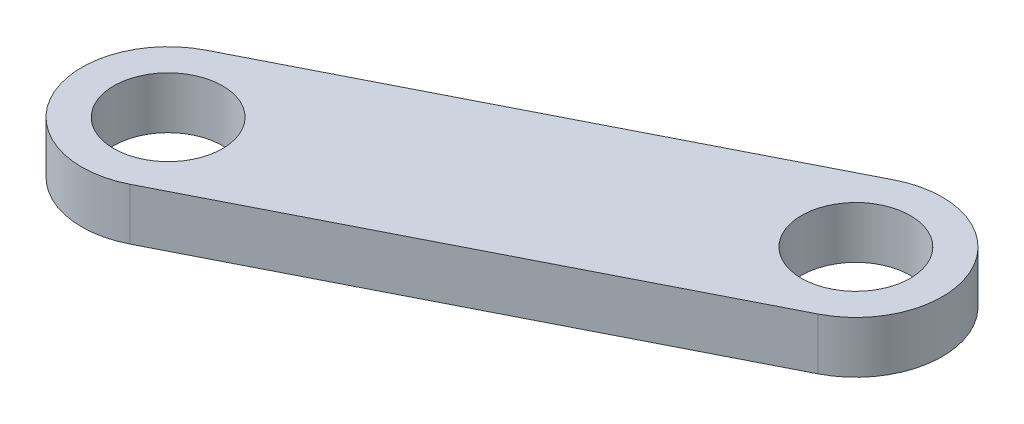
ISO-10303-21;
HEADER;
FILE_DESCRIPTION(('STEP AP214'),'2;1');
FILE_NAME('part.step','',(''),(''),'','','');
FILE_SCHEMA(('AUTOMOTIVE_DESIGN { 1 0 10303 214 1 1 1 1 }'));
ENDSEC;
DATA;
#1=APPLICATION_CONTEXT('core data for automotive mechanical design processes');
#2=APPLICATION_PROTOCOL_DEFINITION('international standard','automotive_design',2000,#1);
#3=PRODUCT_CONTEXT('',#1,'mechanical');
#4=PRODUCT('Part','Part','',(#3));
#5=PRODUCT_RELATED_PRODUCT_CATEGORY('part','',(#4));
#6=PRODUCT_DEFINITION_FORMATION('','',#4);
#7=PRODUCT_DEFINITION_CONTEXT('part definition',#1,'design');
#8=PRODUCT_DEFINITION('design','',#6,#7);
#9=PRODUCT_DEFINITION_SHAPE('','',#8);
#10=(LENGTH_UNIT() NAMED_UNIT(*) SI_UNIT(.MILLI.,.METRE.));
#11=(NAMED_UNIT(*) PLANE_ANGLE_UNIT() SI_UNIT($,.RADIAN.));
#12=(NAMED_UNIT(*) SI_UNIT($,.STERADIAN.) SOLID_ANGLE_UNIT());
#13=UNCERTAINTY_MEASURE_WITH_UNIT(LENGTH_MEASURE(1.E-05),#10,'distance_accuracy_value','');
#14=(GEOMETRIC_REPRESENTATION_CONTEXT(3) GLOBAL_UNCERTAINTY_ASSIGNED_CONTEXT((#13)) GLOBAL_UNIT_ASSIGNED_CONTEXT((#10,
#11,#12)) REPRESENTATION_CONTEXT('',''));
#15=CARTESIAN_POINT('',(0.,0.,0.));
#16=DIRECTION('',(0.,0.,1.));
#17=DIRECTION('',(1.,0.,0.));
#18=AXIS2_PLACEMENT_3D('',#15,#16,#17);
#19=CARTESIAN_POINT('',(0.,-1.905,0.));
#20=DIRECTION('',(0.,1.,0.));
#21=DIRECTION('',(0.,0.,1.));
#22=AXIS2_PLACEMENT_3D('',#19,#20,#21);
#23=CYLINDRICAL_SURFACE('',#22,3.175);
#24=CARTESIAN_POINT('',(0.,0.,0.));
#25=DIRECTION('',(0.,1.,0.));
#26=DIRECTION('',(0.,0.,1.));
#27=AXIS2_PLACEMENT_3D('',#24,#25,#26);
#28=CIRCLE('',#27,3.175);
#29=CARTESIAN_POINT('',(1.43703588397769,0.,2.83117517440381));
#30=VERTEX_POINT('',#29);
#31=CARTESIAN_POINT('',(-1.43703588397769,0.,-2.83117517440381));
#32=VERTEX_POINT('',#31);
#33=EDGE_CURVE('E110',#30,#32,#28,.T.);
#34=ORIENTED_EDGE('',*,*,#33,.F.);
#35=DIRECTION('',(0.,1.,0.));
#36=VECTOR('',#35,1.);
#37=CARTESIAN_POINT('',(1.43703588397769,-1.905,2.83117517440381));
#38=LINE('',#37,#36);
#39=CARTESIAN_POINT('',(1.43703588397769,-1.905,2.83117517440381));
#40=VERTEX_POINT('',#39);
#41=EDGE_CURVE('E11',#40,#30,#38,.T.);
#42=ORIENTED_EDGE('',*,*,#41,.F.);
#43=CARTESIAN_POINT('',(0.,-1.905,0.));
#44=DIRECTION('',(0.,1.,0.));
#45=DIRECTION('',(0.,0.,1.));
#46=AXIS2_PLACEMENT_3D('',#43,#44,#45);
#47=CIRCLE('',#46,3.175);
#48=CARTESIAN_POINT('',(-1.43703588397769,-1.905,-2.83117517440381));
#49=VERTEX_POINT('',#48);
#50=EDGE_CURVE('E101',#40,#49,#47,.T.);
#51=ORIENTED_EDGE('',*,*,#50,.T.);
#52=DIRECTION('',(0.,1.,0.));
#53=VECTOR('',#52,1.);
#54=CARTESIAN_POINT('',(-1.43703588397769,-1.905,-2.83117517440381));
#55=LINE('',#54,#53);
#56=EDGE_CURVE('E42',#49,#32,#55,.T.);
#57=ORIENTED_EDGE('',*,*,#56,.T.);
#58=EDGE_LOOP('',(#34,#42,#51,#57));
#59=FACE_BOUND('',#58,.T.);
#60=ADVANCED_FACE('F39',(#59),#23,.T.);
#61=CARTESIAN_POINT('',(1.43703588397769,-1.905,2.83117517440381));
#62=DIRECTION('',(0.452609727237069,0.,0.891708716347657));
#63=DIRECTION('',(0.891708716347657,0.,-0.452609727237069));
#64=AXIS2_PLACEMENT_3D('',#61,#62,#63);
#65=PLANE('',#64);
#66=DIRECTION('',(0.891708716347657,0.,-0.452609727237069));
#67=VECTOR('',#66,1.);
#68=CARTESIAN_POINT('',(1.43703588397769,0.,2.83117517440381));
#69=LINE('',#68,#67);
#70=CARTESIAN_POINT('',(-15.3269641160223,0.,11.3401751744038));
#71=VERTEX_POINT('',#70);
#72=EDGE_CURVE('E104',#71,#30,#69,.T.);
#73=ORIENTED_EDGE('',*,*,#72,.F.);
#74=DIRECTION('',(0.,1.,0.));
#75=VECTOR('',#74,1.);
#76=CARTESIAN_POINT('',(-15.3269641160223,-1.905,11.3401751744038));
#77=LINE('',#76,#75);
#78=CARTESIAN_POINT('',(-15.3269641160223,-1.905,11.3401751744038));
#79=VERTEX_POINT('',#78);
#80=EDGE_CURVE('E49',#79,#71,#77,.T.);
#81=ORIENTED_EDGE('',*,*,#80,.F.);
#82=DIRECTION('',(0.891708716347657,0.,-0.452609727237069));
#83=VECTOR('',#82,1.);
#84=CARTESIAN_POINT('',(1.43703588397769,-1.905,2.83117517440381));
#85=LINE('',#84,#83);
#86=EDGE_CURVE('E96',#79,#40,#85,.T.);
#87=ORIENTED_EDGE('',*,*,#86,.T.);
#88=ORIENTED_EDGE('',*,*,#41,.T.);
#89=EDGE_LOOP('',(#73,#81,#87,#88));
#90=FACE_BOUND('',#89,.T.);
#91=ADVANCED_FACE('F127',(#90),#65,.T.);
#92=CARTESIAN_POINT('',(-16.764,-1.905,8.509));
#93=DIRECTION('',(0.,1.,0.));
#94=DIRECTION('',(0.,0.,1.));
#95=AXIS2_PLACEMENT_3D('',#92,#93,#94);
#96=CYLINDRICAL_SURFACE('',#95,3.175);
#97=CARTESIAN_POINT('',(-16.764,0.,8.509));
#98=DIRECTION('',(0.,1.,0.));
#99=DIRECTION('',(0.,0.,-1.));
#100=AXIS2_PLACEMENT_3D('',#97,#98,#99);
#101=CIRCLE('',#100,3.175);
#102=CARTESIAN_POINT('',(-18.2010358839777,0.,5.67782482559619));
#103=VERTEX_POINT('',#102);
#104=EDGE_CURVE('E90',#103,#71,#101,.T.);
#105=ORIENTED_EDGE('',*,*,#104,.F.);
#106=DIRECTION('',(0.,1.,0.));
#107=VECTOR('',#106,1.);
#108=CARTESIAN_POINT('',(-18.2010358839777,-1.905,5.67782482559619));
#109=LINE('',#108,#107);
#110=CARTESIAN_POINT('',(-18.2010358839777,-1.905,5.67782482559619));
#111=VERTEX_POINT('',#110);
#112=EDGE_CURVE('E85',#111,#103,#109,.T.);
#113=ORIENTED_EDGE('',*,*,#112,.F.);
#114=CARTESIAN_POINT('',(-16.764,-1.905,8.509));
#115=DIRECTION('',(0.,1.,0.));
#116=DIRECTION('',(0.,0.,-1.));
#117=AXIS2_PLACEMENT_3D('',#114,#115,#116);
#118=CIRCLE('',#117,3.175);
#119=EDGE_CURVE('E88',#111,#79,#118,.T.);
#120=ORIENTED_EDGE('',*,*,#119,.T.);
#121=ORIENTED_EDGE('',*,*,#80,.T.);
#122=EDGE_LOOP('',(#105,#113,#120,#121));
#123=FACE_BOUND('',#122,.T.);
#124=ADVANCED_FACE('F87',(#123),#96,.T.);
#125=CARTESIAN_POINT('',(-1.43703588397769,-1.905,-2.83117517440381));
#126=DIRECTION('',(-0.452609727237069,0.,-0.891708716347657));
#127=DIRECTION('',(-0.891708716347657,0.,0.452609727237069));
#128=AXIS2_PLACEMENT_3D('',#125,#126,#127);
#129=PLANE('',#128);
#130=DIRECTION('',(-0.891708716347657,0.,0.452609727237069));
#131=VECTOR('',#130,1.);
#132=CARTESIAN_POINT('',(-1.43703588397769,0.,-2.83117517440381));
#133=LINE('',#132,#131);
#134=EDGE_CURVE('E114',#32,#103,#133,.T.);
#135=ORIENTED_EDGE('',*,*,#134,.F.);
#136=ORIENTED_EDGE('',*,*,#56,.F.);
#137=DIRECTION('',(-0.891708716347657,0.,0.452609727237069));
#138=VECTOR('',#137,1.);
#139=CARTESIAN_POINT('',(-1.43703588397769,-1.905,-2.83117517440381));
#140=LINE('',#139,#138);
#141=EDGE_CURVE('E95',#49,#111,#140,.T.);
#142=ORIENTED_EDGE('',*,*,#141,.T.);
#143=ORIENTED_EDGE('',*,*,#112,.T.);
#144=EDGE_LOOP('',(#135,#136,#142,#143));
#145=FACE_BOUND('',#144,.T.);
#146=ADVANCED_FACE('F99',(#145),#129,.T.);
#147=CARTESIAN_POINT('',(0.,-1.905,0.));
#148=DIRECTION('',(0.,1.,0.));
#149=DIRECTION('',(0.,0.,1.));
#150=AXIS2_PLACEMENT_3D('',#147,#148,#149);
#151=PLANE('',#150);
#152=CARTESIAN_POINT('',(-16.764,-1.905,8.509));
#153=DIRECTION('',(0.,1.,0.));
#154=DIRECTION('',(0.,0.,1.));
#155=AXIS2_PLACEMENT_3D('',#152,#153,#154);
#156=CIRCLE('',#155,2.);
#157=CARTESIAN_POINT('',(-16.764,-1.905,10.509));
#158=VERTEX_POINT('',#157);
#159=EDGE_CURVE('E160',#158,#158,#156,.T.);
#160=ORIENTED_EDGE('',*,*,#159,.T.);
#161=EDGE_LOOP('',(#160));
#162=FACE_BOUND('',#161,.T.);
#163=CARTESIAN_POINT('',(0.,-1.905,0.));
#164=DIRECTION('',(0.,1.,0.));
#165=DIRECTION('',(0.,0.,1.));
#166=AXIS2_PLACEMENT_3D('',#163,#164,#165);
#167=CIRCLE('',#166,2.);
#168=CARTESIAN_POINT('',(0.,-1.905,2.));
#169=VERTEX_POINT('',#168);
#170=EDGE_CURVE('E115',#169,#169,#167,.T.);
#171=ORIENTED_EDGE('',*,*,#170,.T.);
#172=EDGE_LOOP('',(#171));
#173=FACE_BOUND('',#172,.T.);
#174=ORIENTED_EDGE('',*,*,#50,.F.);
#175=ORIENTED_EDGE('',*,*,#86,.F.);
#176=ORIENTED_EDGE('',*,*,#119,.F.);
#177=ORIENTED_EDGE('',*,*,#141,.F.);
#178=EDGE_LOOP('',(#174,#175,#176,#177));
#179=FACE_BOUND('',#178,.T.);
#180=ADVANCED_FACE('F94',(#162,#173,#179),#151,.F.);
#181=CARTESIAN_POINT('',(0.,0.,0.));
#182=DIRECTION('',(0.,1.,0.));
#183=DIRECTION('',(0.,0.,1.));
#184=AXIS2_PLACEMENT_3D('',#181,#182,#183);
#185=PLANE('',#184);
#186=CARTESIAN_POINT('',(-16.764,0.,8.509));
#187=DIRECTION('',(0.,1.,0.));
#188=DIRECTION('',(0.,0.,1.));
#189=AXIS2_PLACEMENT_3D('',#186,#187,#188);
#190=CIRCLE('',#189,2.);
#191=CARTESIAN_POINT('',(-16.764,0.,10.509));
#192=VERTEX_POINT('',#191);
#193=EDGE_CURVE('E163',#192,#192,#190,.T.);
#194=ORIENTED_EDGE('',*,*,#193,.F.);
#195=EDGE_LOOP('',(#194));
#196=FACE_BOUND('',#195,.T.);
#197=CARTESIAN_POINT('',(0.,0.,0.));
#198=DIRECTION('',(0.,1.,0.));
#199=DIRECTION('',(0.,0.,1.));
#200=AXIS2_PLACEMENT_3D('',#197,#198,#199);
#201=CIRCLE('',#200,2.);
#202=CARTESIAN_POINT('',(0.,0.,2.));
#203=VERTEX_POINT('',#202);
#204=EDGE_CURVE('E167',#203,#203,#201,.T.);
#205=ORIENTED_EDGE('',*,*,#204,.F.);
#206=EDGE_LOOP('',(#205));
#207=FACE_BOUND('',#206,.T.);
#208=ORIENTED_EDGE('',*,*,#33,.T.);
#209=ORIENTED_EDGE('',*,*,#134,.T.);
#210=ORIENTED_EDGE('',*,*,#104,.T.);
#211=ORIENTED_EDGE('',*,*,#72,.T.);
#212=EDGE_LOOP('',(#208,#209,#210,#211));
#213=FACE_BOUND('',#212,.T.);
#214=ADVANCED_FACE('F126',(#196,#207,#213),#185,.T.);
#215=CARTESIAN_POINT('',(0.,-1.905,0.));
#216=DIRECTION('',(0.,1.,0.));
#217=DIRECTION('',(0.,0.,1.));
#218=AXIS2_PLACEMENT_3D('',#215,#216,#217);
#219=CYLINDRICAL_SURFACE('',#218,2.);
#220=CARTESIAN_POINT('',(0.,-1.905,2.));
#221=CARTESIAN_POINT('',(0.,-1.88515625,2.));
#222=CARTESIAN_POINT('',(0.,-1.8653125,2.));
#223=CARTESIAN_POINT('',(0.,-1.825625,2.));
#224=CARTESIAN_POINT('',(0.,-1.80578125,2.));
#225=CARTESIAN_POINT('',(0.,-1.76609375,2.));
#226=CARTESIAN_POINT('',(0.,-1.74625,2.));
#227=CARTESIAN_POINT('',(0.,-1.7065625,2.));
#228=CARTESIAN_POINT('',(0.,-1.68671875,2.));
#229=CARTESIAN_POINT('',(0.,-1.64703125,2.));
#230=CARTESIAN_POINT('',(0.,-1.6271875,2.));
#231=CARTESIAN_POINT('',(0.,-1.5875,2.));
#232=CARTESIAN_POINT('',(0.,-1.56765625,2.));
#233=CARTESIAN_POINT('',(0.,-1.52796875,2.));
#234=CARTESIAN_POINT('',(0.,-1.508125,2.));
#235=CARTESIAN_POINT('',(0.,-1.4684375,2.));
#236=CARTESIAN_POINT('',(0.,-1.44859375,2.));
#237=CARTESIAN_POINT('',(0.,-1.40890625,2.));
#238=CARTESIAN_POINT('',(0.,-1.3890625,2.));
#239=CARTESIAN_POINT('',(0.,-1.349375,2.));
#240=CARTESIAN_POINT('',(0.,-1.32953125,2.));
#241=CARTESIAN_POINT('',(0.,-1.28984375,2.));
#242=CARTESIAN_POINT('',(0.,-1.27,2.));
#243=CARTESIAN_POINT('',(0.,-1.2303125,2.));
#244=CARTESIAN_POINT('',(0.,-1.21046875,2.));
#245=CARTESIAN_POINT('',(0.,-1.17078125,2.));
#246=CARTESIAN_POINT('',(0.,-1.1509375,2.));
#247=CARTESIAN_POINT('',(0.,-1.11125,2.));
#248=CARTESIAN_POINT('',(0.,-1.09140625,2.));
#249=CARTESIAN_POINT('',(0.,-1.05171875,2.));
#250=CARTESIAN_POINT('',(0.,-1.031875,2.));
#251=CARTESIAN_POINT('',(0.,-0.9921875,2.));
#252=CARTESIAN_POINT('',(0.,-0.97234375,2.));
#253=CARTESIAN_POINT('',(0.,-0.93265625,2.));
#254=CARTESIAN_POINT('',(0.,-0.9128125,2.));
#255=CARTESIAN_POINT('',(0.,-0.873125,2.));
#256=CARTESIAN_POINT('',(0.,-0.85328125,2.));
#257=CARTESIAN_POINT('',(0.,-0.81359375,2.));
#258=CARTESIAN_POINT('',(0.,-0.79375,2.));
#259=CARTESIAN_POINT('',(0.,-0.7540625,2.));
#260=CARTESIAN_POINT('',(0.,-0.73421875,2.));
#261=CARTESIAN_POINT('',(0.,-0.69453125,2.));
#262=CARTESIAN_POINT('',(0.,-0.6746875,2.));
#263=CARTESIAN_POINT('',(0.,-0.635,2.));
#264=CARTESIAN_POINT('',(0.,-0.61515625,2.));
#265=CARTESIAN_POINT('',(0.,-0.57546875,2.));
#266=CARTESIAN_POINT('',(0.,-0.555625,2.));
#267=CARTESIAN_POINT('',(0.,-0.5159375,2.));
#268=CARTESIAN_POINT('',(0.,-0.49609375,2.));
#269=CARTESIAN_POINT('',(0.,-0.45640625,2.));
#270=CARTESIAN_POINT('',(0.,-0.4365625,2.));
#271=CARTESIAN_POINT('',(0.,-0.396875,2.));
#272=CARTESIAN_POINT('',(0.,-0.37703125,2.));
#273=CARTESIAN_POINT('',(0.,-0.33734375,2.));
#274=CARTESIAN_POINT('',(0.,-0.3175,2.));
#275=CARTESIAN_POINT('',(0.,-0.2778125,2.));
#276=CARTESIAN_POINT('',(0.,-0.25796875,2.));
#277=CARTESIAN_POINT('',(0.,-0.21828125,2.));
#278=CARTESIAN_POINT('',(0.,-0.1984375,2.));
#279=CARTESIAN_POINT('',(0.,-0.15875,2.));
#280=CARTESIAN_POINT('',(0.,-0.13890625,2.));
#281=CARTESIAN_POINT('',(0.,-0.09921875,2.));
#282=CARTESIAN_POINT('',(0.,-0.0793749999999999,2.));
#283=CARTESIAN_POINT('',(0.,-0.0396874999999999,2.));
#284=CARTESIAN_POINT('',(0.,-0.01984375,2.));
#285=CARTESIAN_POINT('',(0.,0.,2.));
#286=B_SPLINE_CURVE_WITH_KNOTS('',3,(#220,#221,#222,#223,#224,#225,#226,#227,#228,#229,#230,
#231,#232,#233,#234,#235,#236,#237,#238,#239,#240,#241,#242,#243,#244,#245,#246,#247,#248,#249,
#250,#251,#252,#253,#254,#255,#256,#257,#258,#259,#260,#261,#262,#263,#264,#265,#266,#267,#268,
#269,#270,#271,#272,#273,#274,#275,#276,#277,#278,#279,#280,#281,#282,#283,#284,#285),
.UNSPECIFIED.,.F.,.F.,(4,2,2,2,2,2,2,2,2,2,2,2,2,2,2,2,2,2,2,2,2,2,2,2,2,2,2,2,2,2,2,2,4),(0.,
0.0595312500000001,0.1190625,0.17859375,0.238125,0.29765625,0.3571875,0.41671875,0.47625,
0.53578125,0.5953125,0.65484375,0.714375,0.77390625,0.8334375,0.89296875,0.9525,1.01203125,
1.0715625,1.13109375,1.190625,1.25015625,1.3096875,1.36921875,1.42875,1.48828125,1.5478125,
1.60734375,1.666875,1.72640625,1.7859375,1.84546875,1.905),.UNSPECIFIED.);
#287=EDGE_CURVE('BSEAM145',#169,#203,#286,.T.);
#288=ORIENTED_EDGE('',*,*,#170,.F.);
#289=ORIENTED_EDGE('',*,*,#204,.T.);
#290=ORIENTED_EDGE('',*,*,#287,.T.);
#291=ORIENTED_EDGE('',*,*,#287,.F.);
#292=EDGE_LOOP('',(#288,#290,#289,#291));
#293=FACE_BOUND('',#292,.T.);
#294=ADVANCED_FACE('F145',(#293),#219,.F.);
#295=CARTESIAN_POINT('',(-16.764,-1.905,8.509));
#296=DIRECTION('',(0.,1.,0.));
#297=DIRECTION('',(0.,0.,1.));
#298=AXIS2_PLACEMENT_3D('',#295,#296,#297);
#299=CYLINDRICAL_SURFACE('',#298,2.);
#300=CARTESIAN_POINT('',(-16.764,-1.905,10.509));
#301=CARTESIAN_POINT('',(-16.764,-1.88515625,10.509));
#302=CARTESIAN_POINT('',(-16.764,-1.8653125,10.509));
#303=CARTESIAN_POINT('',(-16.764,-1.825625,10.509));
#304=CARTESIAN_POINT('',(-16.764,-1.80578125,10.509));
#305=CARTESIAN_POINT('',(-16.764,-1.76609375,10.509));
#306=CARTESIAN_POINT('',(-16.764,-1.74625,10.509));
#307=CARTESIAN_POINT('',(-16.764,-1.7065625,10.509));
#308=CARTESIAN_POINT('',(-16.764,-1.68671875,10.509));
#309=CARTESIAN_POINT('',(-16.764,-1.64703125,10.509));
#310=CARTESIAN_POINT('',(-16.764,-1.6271875,10.509));
#311=CARTESIAN_POINT('',(-16.764,-1.5875,10.509));
#312=CARTESIAN_POINT('',(-16.764,-1.56765625,10.509));
#313=CARTESIAN_POINT('',(-16.764,-1.52796875,10.509));
#314=CARTESIAN_POINT('',(-16.764,-1.508125,10.509));
#315=CARTESIAN_POINT('',(-16.764,-1.4684375,10.509));
#316=CARTESIAN_POINT('',(-16.764,-1.44859375,10.509));
#317=CARTESIAN_POINT('',(-16.764,-1.40890625,10.509));
#318=CARTESIAN_POINT('',(-16.764,-1.3890625,10.509));
#319=CARTESIAN_POINT('',(-16.764,-1.349375,10.509));
#320=CARTESIAN_POINT('',(-16.764,-1.32953125,10.509));
#321=CARTESIAN_POINT('',(-16.764,-1.28984375,10.509));
#322=CARTESIAN_POINT('',(-16.764,-1.27,10.509));
#323=CARTESIAN_POINT('',(-16.764,-1.2303125,10.509));
#324=CARTESIAN_POINT('',(-16.764,-1.21046875,10.509));
#325=CARTESIAN_POINT('',(-16.764,-1.17078125,10.509));
#326=CARTESIAN_POINT('',(-16.764,-1.1509375,10.509));
#327=CARTESIAN_POINT('',(-16.764,-1.11125,10.509));
#328=CARTESIAN_POINT('',(-16.764,-1.09140625,10.509));
#329=CARTESIAN_POINT('',(-16.764,-1.05171875,10.509));
#330=CARTESIAN_POINT('',(-16.764,-1.031875,10.509));
#331=CARTESIAN_POINT('',(-16.764,-0.9921875,10.509));
#332=CARTESIAN_POINT('',(-16.764,-0.97234375,10.509));
#333=CARTESIAN_POINT('',(-16.764,-0.93265625,10.509));
#334=CARTESIAN_POINT('',(-16.764,-0.9128125,10.509));
#335=CARTESIAN_POINT('',(-16.764,-0.873125,10.509));
#336=CARTESIAN_POINT('',(-16.764,-0.85328125,10.509));
#337=CARTESIAN_POINT('',(-16.764,-0.81359375,10.509));
#338=CARTESIAN_POINT('',(-16.764,-0.79375,10.509));
#339=CARTESIAN_POINT('',(-16.764,-0.7540625,10.509));
#340=CARTESIAN_POINT('',(-16.764,-0.73421875,10.509));
#341=CARTESIAN_POINT('',(-16.764,-0.69453125,10.509));
#342=CARTESIAN_POINT('',(-16.764,-0.6746875,10.509));
#343=CARTESIAN_POINT('',(-16.764,-0.635,10.509));
#344=CARTESIAN_POINT('',(-16.764,-0.61515625,10.509));
#345=CARTESIAN_POINT('',(-16.764,-0.57546875,10.509));
#346=CARTESIAN_POINT('',(-16.764,-0.555625,10.509));
#347=CARTESIAN_POINT('',(-16.764,-0.5159375,10.509));
#348=CARTESIAN_POINT('',(-16.764,-0.49609375,10.509));
#349=CARTESIAN_POINT('',(-16.764,-0.45640625,10.509));
#350=CARTESIAN_POINT('',(-16.764,-0.4365625,10.509));
#351=CARTESIAN_POINT('',(-16.764,-0.396875,10.509));
#352=CARTESIAN_POINT('',(-16.764,-0.37703125,10.509));
#353=CARTESIAN_POINT('',(-16.764,-0.33734375,10.509));
#354=CARTESIAN_POINT('',(-16.764,-0.3175,10.509));
#355=CARTESIAN_POINT('',(-16.764,-0.2778125,10.509));
#356=CARTESIAN_POINT('',(-16.764,-0.25796875,10.509));
#357=CARTESIAN_POINT('',(-16.764,-0.21828125,10.509));
#358=CARTESIAN_POINT('',(-16.764,-0.1984375,10.509));
#359=CARTESIAN_POINT('',(-16.764,-0.15875,10.509));
#360=CARTESIAN_POINT('',(-16.764,-0.13890625,10.509));
#361=CARTESIAN_POINT('',(-16.764,-0.09921875,10.509));
#362=CARTESIAN_POINT('',(-16.764,-0.0793749999999999,10.509));
#363=CARTESIAN_POINT('',(-16.764,-0.0396874999999999,10.509));
#364=CARTESIAN_POINT('',(-16.764,-0.01984375,10.509));
#365=CARTESIAN_POINT('',(-16.764,0.,10.509));
#366=B_SPLINE_CURVE_WITH_KNOTS('',3,(#300,#301,#302,#303,#304,#305,#306,#307,#308,#309,#310,
#311,#312,#313,#314,#315,#316,#317,#318,#319,#320,#321,#322,#323,#324,#325,#326,#327,#328,#329,
#330,#331,#332,#333,#334,#335,#336,#337,#338,#339,#340,#341,#342,#343,#344,#345,#346,#347,#348,
#349,#350,#351,#352,#353,#354,#355,#356,#357,#358,#359,#360,#361,#362,#363,#364,#365),
.UNSPECIFIED.,.F.,.F.,(4,2,2,2,2,2,2,2,2,2,2,2,2,2,2,2,2,2,2,2,2,2,2,2,2,2,2,2,2,2,2,2,4),(0.,
0.0595312500000001,0.1190625,0.17859375,0.238125,0.29765625,0.3571875,0.41671875,0.47625,
0.53578125,0.5953125,0.65484375,0.714375,0.77390625,0.8334375,0.89296875,0.9525,1.01203125,
1.0715625,1.13109375,1.190625,1.25015625,1.3096875,1.36921875,1.42875,1.48828125,1.5478125,
1.60734375,1.666875,1.72640625,1.7859375,1.84546875,1.905),.UNSPECIFIED.);
#367=EDGE_CURVE('BSEAM152',#158,#192,#366,.T.);
#368=ORIENTED_EDGE('',*,*,#159,.F.);
#369=ORIENTED_EDGE('',*,*,#193,.T.);
#370=ORIENTED_EDGE('',*,*,#367,.T.);
#371=ORIENTED_EDGE('',*,*,#367,.F.);
#372=EDGE_LOOP('',(#368,#370,#369,#371));
#373=FACE_BOUND('',#372,.T.);
#374=ADVANCED_FACE('F152',(#373),#299,.F.);
#375=CLOSED_SHELL('',(#60,#91,#124,#146,#180,#214,#294,#374));
#376=MANIFOLD_SOLID_BREP('B2',#375);
#377=ADVANCED_BREP_SHAPE_REPRESENTATION('',(#18,#376),#14);
#378=SHAPE_DEFINITION_REPRESENTATION(#9,#377);
ENDSEC;
END-ISO-10303-21;
